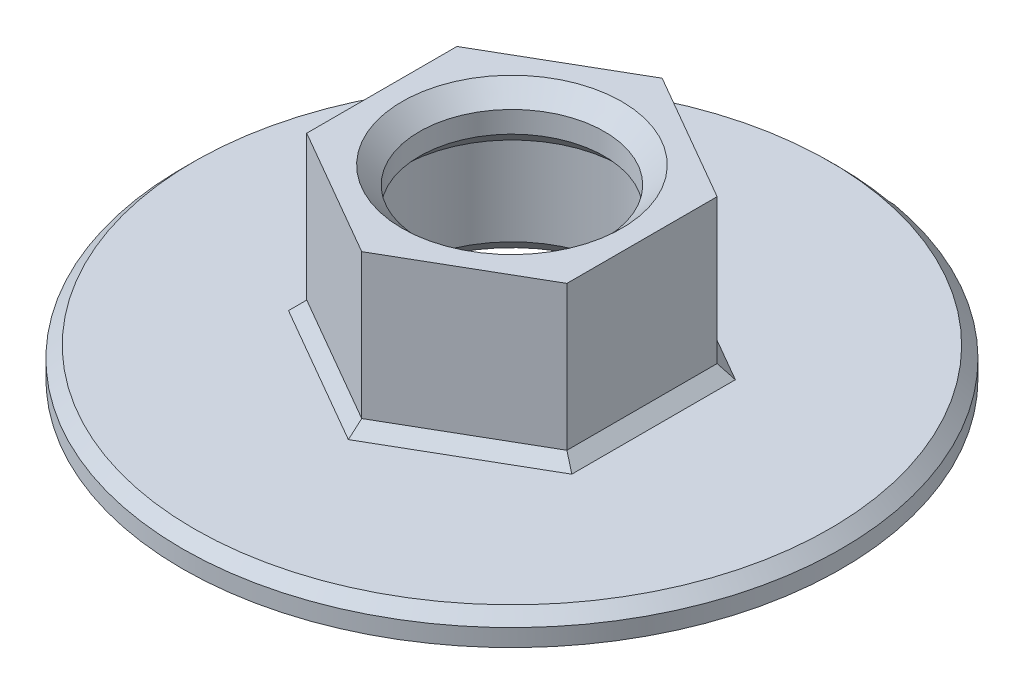
ISO-10303-21;
HEADER;
FILE_DESCRIPTION(('STEP AP214'),'2;1');
FILE_NAME('part.step','',(''),(''),'','','');
FILE_SCHEMA(('AUTOMOTIVE_DESIGN { 1 0 10303 214 1 1 1 1 }'));
ENDSEC;
DATA;
#1=APPLICATION_CONTEXT('core data for automotive mechanical design processes');
#2=APPLICATION_PROTOCOL_DEFINITION('international standard','automotive_design',2000,#1);
#3=PRODUCT_CONTEXT('',#1,'mechanical');
#4=PRODUCT('Part','Part','',(#3));
#5=PRODUCT_RELATED_PRODUCT_CATEGORY('part','',(#4));
#6=PRODUCT_DEFINITION_FORMATION('','',#4);
#7=PRODUCT_DEFINITION_CONTEXT('part definition',#1,'design');
#8=PRODUCT_DEFINITION('design','',#6,#7);
#9=PRODUCT_DEFINITION_SHAPE('','',#8);
#10=(LENGTH_UNIT() NAMED_UNIT(*) SI_UNIT(.MILLI.,.METRE.));
#11=(NAMED_UNIT(*) PLANE_ANGLE_UNIT() SI_UNIT($,.RADIAN.));
#12=(NAMED_UNIT(*) SI_UNIT($,.STERADIAN.) SOLID_ANGLE_UNIT());
#13=UNCERTAINTY_MEASURE_WITH_UNIT(LENGTH_MEASURE(1.E-05),#10,'distance_accuracy_value','');
#14=(GEOMETRIC_REPRESENTATION_CONTEXT(3) GLOBAL_UNCERTAINTY_ASSIGNED_CONTEXT((#13)) GLOBAL_UNIT_ASSIGNED_CONTEXT((#10,
#11,#12)) REPRESENTATION_CONTEXT('',''));
#15=CARTESIAN_POINT('',(0.,0.,0.));
#16=DIRECTION('',(0.,0.,1.));
#17=DIRECTION('',(1.,0.,0.));
#18=AXIS2_PLACEMENT_3D('',#15,#16,#17);
#19=CARTESIAN_POINT('',(0.,0.,0.));
#20=DIRECTION('',(0.,1.,0.));
#21=DIRECTION('',(0.,0.,1.));
#22=AXIS2_PLACEMENT_3D('',#19,#20,#21);
#23=PLANE('',#22);
#24=CARTESIAN_POINT('',(0.,0.,0.));
#25=DIRECTION('',(0.,1.,0.));
#26=DIRECTION('',(0.,0.,1.));
#27=AXIS2_PLACEMENT_3D('',#24,#25,#26);
#28=CIRCLE('',#27,11.175);
#29=CARTESIAN_POINT('',(0.,0.,11.175));
#30=VERTEX_POINT('',#29);
#31=EDGE_CURVE('E175',#30,#30,#28,.T.);
#32=ORIENTED_EDGE('',*,*,#31,.T.);
#33=EDGE_LOOP('',(#32));
#34=FACE_BOUND('',#33,.T.);
#35=CARTESIAN_POINT('',(0.,0.,0.));
#36=DIRECTION('',(0.,1.,0.));
#37=DIRECTION('',(0.,0.,1.));
#38=AXIS2_PLACEMENT_3D('',#35,#36,#37);
#39=CIRCLE('',#38,25.);
#40=CARTESIAN_POINT('',(-3.33679125812165,0.,-24.7763157894737));
#41=VERTEX_POINT('',#40);
#42=CARTESIAN_POINT('',(3.33679125812165,0.,-24.7763157894737));
#43=VERTEX_POINT('',#42);
#44=EDGE_CURVE('E162',#41,#43,#39,.T.);
#45=ORIENTED_EDGE('',*,*,#44,.F.);
#46=CARTESIAN_POINT('',(0.,0.,-28.5));
#47=DIRECTION('',(0.,1.,0.));
#48=DIRECTION('',(0.,0.,1.));
#49=AXIS2_PLACEMENT_3D('',#46,#47,#48);
#50=CIRCLE('',#49,5.00000000000001);
#51=CARTESIAN_POINT('',(-4.92965069306931,0.,-27.6642105263158));
#52=VERTEX_POINT('',#51);
#53=EDGE_CURVE('E62',#52,#41,#50,.T.);
#54=ORIENTED_EDGE('',*,*,#53,.F.);
#55=CARTESIAN_POINT('',(0.,0.,0.));
#56=DIRECTION('',(0.,1.,0.));
#57=DIRECTION('',(0.,0.,1.));
#58=AXIS2_PLACEMENT_3D('',#55,#56,#57);
#59=CIRCLE('',#58,28.1);
#60=CARTESIAN_POINT('',(4.92965069306931,0.,-27.6642105263158));
#61=VERTEX_POINT('',#60);
#62=EDGE_CURVE('E164',#52,#61,#59,.F.);
#63=ORIENTED_EDGE('',*,*,#62,.T.);
#64=EDGE_CURVE('E152',#43,#61,#50,.T.);
#65=ORIENTED_EDGE('',*,*,#64,.F.);
#66=EDGE_LOOP('',(#45,#54,#63,#65));
#67=FACE_BOUND('',#66,.T.);
#68=ADVANCED_FACE('F40',(#34,#67),#23,.F.);
#69=CARTESIAN_POINT('',(0.,0.6,0.));
#70=DIRECTION('',(0.,-1.,0.));
#71=DIRECTION('',(0.,0.,-1.));
#72=AXIS2_PLACEMENT_3D('',#69,#70,#71);
#73=CYLINDRICAL_SURFACE('',#72,9.675);
#74=CARTESIAN_POINT('',(0.,1.5,0.));
#75=DIRECTION('',(0.,1.,0.));
#76=DIRECTION('',(0.,0.,1.));
#77=AXIS2_PLACEMENT_3D('',#74,#75,#76);
#78=CIRCLE('',#77,9.675);
#79=CARTESIAN_POINT('',(0.,1.5,9.675));
#80=VERTEX_POINT('',#79);
#81=EDGE_CURVE('E169',#80,#80,#78,.F.);
#82=ORIENTED_EDGE('',*,*,#81,.T.);
#83=EDGE_LOOP('',(#82));
#84=FACE_BOUND('',#83,.T.);
#85=CARTESIAN_POINT('',(0.,9.25,0.));
#86=DIRECTION('',(0.,1.,0.));
#87=DIRECTION('',(0.,0.,1.));
#88=AXIS2_PLACEMENT_3D('',#85,#86,#87);
#89=CIRCLE('',#88,9.675);
#90=CARTESIAN_POINT('',(0.,9.25,9.675));
#91=VERTEX_POINT('',#90);
#92=EDGE_CURVE('E333',#91,#91,#89,.T.);
#93=ORIENTED_EDGE('',*,*,#92,.T.);
#94=EDGE_LOOP('',(#93));
#95=FACE_BOUND('',#94,.T.);
#96=ADVANCED_FACE('F286',(#84,#95),#73,.F.);
#97=CARTESIAN_POINT('',(0.,0.6,0.));
#98=DIRECTION('',(0.,1.,0.));
#99=DIRECTION('',(0.,0.,1.));
#100=AXIS2_PLACEMENT_3D('',#97,#98,#99);
#101=PLANE('',#100);
#102=DIRECTION('',(0.,0.,1.));
#103=VECTOR('',#102,1.);
#104=CARTESIAN_POINT('',(12.25,0.6,0.));
#105=LINE('',#104,#103);
#106=CARTESIAN_POINT('',(12.25,0.6,-7.07254079757292));
#107=VERTEX_POINT('',#106);
#108=CARTESIAN_POINT('',(12.25,0.6,7.07254079757292));
#109=VERTEX_POINT('',#108);
#110=EDGE_CURVE('E192',#107,#109,#105,.T.);
#111=ORIENTED_EDGE('',*,*,#110,.T.);
#112=DIRECTION('',(-0.866025403784439,0.,0.5));
#113=VECTOR('',#112,1.);
#114=CARTESIAN_POINT('',(6.125,0.6,10.6088111963594));
#115=LINE('',#114,#113);
#116=CARTESIAN_POINT('',(0.,0.6,14.1450815951458));
#117=VERTEX_POINT('',#116);
#118=EDGE_CURVE('E194',#109,#117,#115,.T.);
#119=ORIENTED_EDGE('',*,*,#118,.T.);
#120=DIRECTION('',(-0.866025403784439,0.,-0.5));
#121=VECTOR('',#120,1.);
#122=CARTESIAN_POINT('',(-6.125,0.6,10.6088111963594));
#123=LINE('',#122,#121);
#124=CARTESIAN_POINT('',(-12.25,0.6,7.07254079757292));
#125=VERTEX_POINT('',#124);
#126=EDGE_CURVE('E184',#117,#125,#123,.T.);
#127=ORIENTED_EDGE('',*,*,#126,.T.);
#128=DIRECTION('',(0.,0.,-1.));
#129=VECTOR('',#128,1.);
#130=CARTESIAN_POINT('',(-12.25,0.6,0.));
#131=LINE('',#130,#129);
#132=CARTESIAN_POINT('',(-12.25,0.6,-7.07254079757292));
#133=VERTEX_POINT('',#132);
#134=EDGE_CURVE('E186',#125,#133,#131,.T.);
#135=ORIENTED_EDGE('',*,*,#134,.T.);
#136=DIRECTION('',(0.866025403784439,0.,-0.5));
#137=VECTOR('',#136,1.);
#138=CARTESIAN_POINT('',(-6.125,0.6,-10.6088111963594));
#139=LINE('',#138,#137);
#140=CARTESIAN_POINT('',(0.,0.6,-14.1450815951458));
#141=VERTEX_POINT('',#140);
#142=EDGE_CURVE('E188',#133,#141,#139,.T.);
#143=ORIENTED_EDGE('',*,*,#142,.T.);
#144=DIRECTION('',(0.866025403784439,0.,0.5));
#145=VECTOR('',#144,1.);
#146=CARTESIAN_POINT('',(6.125,0.6,-10.6088111963594));
#147=LINE('',#146,#145);
#148=EDGE_CURVE('E190',#141,#107,#147,.T.);
#149=ORIENTED_EDGE('',*,*,#148,.T.);
#150=EDGE_LOOP('',(#111,#119,#127,#135,#143,#149));
#151=FACE_BOUND('',#150,.T.);
#152=CARTESIAN_POINT('',(0.,0.6,0.));
#153=DIRECTION('',(0.,1.,0.));
#154=DIRECTION('',(0.,0.,1.));
#155=AXIS2_PLACEMENT_3D('',#152,#153,#154);
#156=CIRCLE('',#155,27.5);
#157=CARTESIAN_POINT('',(0.,0.6,27.5));
#158=VERTEX_POINT('',#157);
#159=EDGE_CURVE('E172',#158,#158,#156,.T.);
#160=ORIENTED_EDGE('',*,*,#159,.T.);
#161=EDGE_LOOP('',(#160));
#162=FACE_BOUND('',#161,.T.);
#163=ADVANCED_FACE('F263',(#151,#162),#101,.T.);
#164=CARTESIAN_POINT('',(0.,14.1,0.));
#165=DIRECTION('',(0.,1.,0.));
#166=DIRECTION('',(0.,0.,1.));
#167=AXIS2_PLACEMENT_3D('',#164,#165,#166);
#168=PLANE('',#167);
#169=CARTESIAN_POINT('',(0.,14.1,0.));
#170=DIRECTION('',(0.,1.,0.));
#171=DIRECTION('',(0.,0.,1.));
#172=AXIS2_PLACEMENT_3D('',#169,#170,#171);
#173=CIRCLE('',#172,9.50000000000001);
#174=CARTESIAN_POINT('',(0.,14.1,9.50000000000001));
#175=VERTEX_POINT('',#174);
#176=EDGE_CURVE('E321',#175,#175,#173,.F.);
#177=ORIENTED_EDGE('',*,*,#176,.T.);
#178=EDGE_LOOP('',(#177));
#179=FACE_BOUND('',#178,.T.);
#180=DIRECTION('',(-0.866025403784439,0.,-0.5));
#181=VECTOR('',#180,1.);
#182=CARTESIAN_POINT('',(11.25,14.1,-6.4951905283833));
#183=LINE('',#182,#181);
#184=CARTESIAN_POINT('',(11.25,14.1,-6.4951905283833));
#185=VERTEX_POINT('',#184);
#186=CARTESIAN_POINT('',(0.,14.1,-12.9903810567666));
#187=VERTEX_POINT('',#186);
#188=EDGE_CURVE('E336',#185,#187,#183,.T.);
#189=ORIENTED_EDGE('',*,*,#188,.T.);
#190=DIRECTION('',(-0.866025403784439,0.,0.5));
#191=VECTOR('',#190,1.);
#192=CARTESIAN_POINT('',(0.,14.1,-12.9903810567666));
#193=LINE('',#192,#191);
#194=CARTESIAN_POINT('',(-11.25,14.1,-6.49519052838329));
#195=VERTEX_POINT('',#194);
#196=EDGE_CURVE('E361',#187,#195,#193,.T.);
#197=ORIENTED_EDGE('',*,*,#196,.T.);
#198=DIRECTION('',(0.,0.,1.));
#199=VECTOR('',#198,1.);
#200=CARTESIAN_POINT('',(-11.25,14.1,-6.49519052838329));
#201=LINE('',#200,#199);
#202=CARTESIAN_POINT('',(-11.25,14.1,6.49519052838329));
#203=VERTEX_POINT('',#202);
#204=EDGE_CURVE('E359',#195,#203,#201,.T.);
#205=ORIENTED_EDGE('',*,*,#204,.T.);
#206=DIRECTION('',(0.866025403784439,0.,0.5));
#207=VECTOR('',#206,1.);
#208=CARTESIAN_POINT('',(-11.25,14.1,6.49519052838329));
#209=LINE('',#208,#207);
#210=CARTESIAN_POINT('',(0.,14.1,12.9903810567666));
#211=VERTEX_POINT('',#210);
#212=EDGE_CURVE('E357',#203,#211,#209,.T.);
#213=ORIENTED_EDGE('',*,*,#212,.T.);
#214=DIRECTION('',(0.866025403784439,0.,-0.5));
#215=VECTOR('',#214,1.);
#216=CARTESIAN_POINT('',(0.,14.1,12.9903810567666));
#217=LINE('',#216,#215);
#218=CARTESIAN_POINT('',(11.25,14.1,6.49519052838329));
#219=VERTEX_POINT('',#218);
#220=EDGE_CURVE('E355',#211,#219,#217,.T.);
#221=ORIENTED_EDGE('',*,*,#220,.T.);
#222=DIRECTION('',(0.,0.,-1.));
#223=VECTOR('',#222,1.);
#224=CARTESIAN_POINT('',(11.25,14.1,6.49519052838329));
#225=LINE('',#224,#223);
#226=EDGE_CURVE('E353',#219,#185,#225,.T.);
#227=ORIENTED_EDGE('',*,*,#226,.T.);
#228=EDGE_LOOP('',(#189,#197,#205,#213,#221,#227));
#229=FACE_BOUND('',#228,.T.);
#230=ADVANCED_FACE('F259',(#179,#229),#168,.T.);
#231=CARTESIAN_POINT('',(11.25,14.1,-6.4951905283833));
#232=DIRECTION('',(-0.5,0.,0.866025403784439));
#233=DIRECTION('',(0.866025403784439,0.,0.5));
#234=AXIS2_PLACEMENT_3D('',#231,#232,#233);
#235=PLANE('',#234);
#236=DIRECTION('',(0.,-1.,0.));
#237=VECTOR('',#236,1.);
#238=CARTESIAN_POINT('',(11.25,14.1,-6.4951905283833));
#239=LINE('',#238,#237);
#240=CARTESIAN_POINT('',(11.25,1.60000000000001,-6.4951905283833));
#241=VERTEX_POINT('',#240);
#242=EDGE_CURVE('E350',#185,#241,#239,.T.);
#243=ORIENTED_EDGE('',*,*,#242,.T.);
#244=DIRECTION('',(-0.866025403784439,0.,-0.5));
#245=VECTOR('',#244,1.);
#246=CARTESIAN_POINT('',(11.25,1.60000000000001,-6.4951905283833));
#247=LINE('',#246,#245);
#248=CARTESIAN_POINT('',(0.,1.60000000000001,-12.9903810567666));
#249=VERTEX_POINT('',#248);
#250=EDGE_CURVE('E199',#241,#249,#247,.T.);
#251=ORIENTED_EDGE('',*,*,#250,.T.);
#252=DIRECTION('',(0.,-1.,0.));
#253=VECTOR('',#252,1.);
#254=CARTESIAN_POINT('',(0.,14.1,-12.9903810567666));
#255=LINE('',#254,#253);
#256=EDGE_CURVE('E332',#187,#249,#255,.T.);
#257=ORIENTED_EDGE('',*,*,#256,.F.);
#258=ORIENTED_EDGE('',*,*,#188,.F.);
#259=EDGE_LOOP('',(#243,#251,#257,#258));
#260=FACE_BOUND('',#259,.T.);
#261=ADVANCED_FACE('F262',(#260),#235,.F.);
#262=CARTESIAN_POINT('',(0.,14.1,-12.9903810567666));
#263=DIRECTION('',(0.5,0.,0.866025403784439));
#264=DIRECTION('',(0.866025403784439,0.,-0.5));
#265=AXIS2_PLACEMENT_3D('',#262,#263,#264);
#266=PLANE('',#265);
#267=ORIENTED_EDGE('',*,*,#256,.T.);
#268=DIRECTION('',(-0.866025403784439,0.,0.5));
#269=VECTOR('',#268,1.);
#270=CARTESIAN_POINT('',(0.,1.60000000000001,-12.9903810567666));
#271=LINE('',#270,#269);
#272=CARTESIAN_POINT('',(-11.25,1.60000000000001,-6.49519052838329));
#273=VERTEX_POINT('',#272);
#274=EDGE_CURVE('E201',#249,#273,#271,.T.);
#275=ORIENTED_EDGE('',*,*,#274,.T.);
#276=DIRECTION('',(0.,-1.,0.));
#277=VECTOR('',#276,1.);
#278=CARTESIAN_POINT('',(-11.25,14.1,-6.49519052838329));
#279=LINE('',#278,#277);
#280=EDGE_CURVE('E340',#195,#273,#279,.T.);
#281=ORIENTED_EDGE('',*,*,#280,.F.);
#282=ORIENTED_EDGE('',*,*,#196,.F.);
#283=EDGE_LOOP('',(#267,#275,#281,#282));
#284=FACE_BOUND('',#283,.T.);
#285=ADVANCED_FACE('F279',(#284),#266,.F.);
#286=CARTESIAN_POINT('',(-11.25,14.1,-6.49519052838329));
#287=DIRECTION('',(1.,0.,0.));
#288=DIRECTION('',(0.,0.,-1.));
#289=AXIS2_PLACEMENT_3D('',#286,#287,#288);
#290=PLANE('',#289);
#291=ORIENTED_EDGE('',*,*,#280,.T.);
#292=DIRECTION('',(0.,0.,1.));
#293=VECTOR('',#292,1.);
#294=CARTESIAN_POINT('',(-11.25,1.60000000000001,-6.49519052838329));
#295=LINE('',#294,#293);
#296=CARTESIAN_POINT('',(-11.25,1.60000000000001,6.49519052838329));
#297=VERTEX_POINT('',#296);
#298=EDGE_CURVE('E70',#273,#297,#295,.T.);
#299=ORIENTED_EDGE('',*,*,#298,.T.);
#300=DIRECTION('',(0.,-1.,0.));
#301=VECTOR('',#300,1.);
#302=CARTESIAN_POINT('',(-11.25,14.1,6.49519052838329));
#303=LINE('',#302,#301);
#304=EDGE_CURVE('E342',#203,#297,#303,.T.);
#305=ORIENTED_EDGE('',*,*,#304,.F.);
#306=ORIENTED_EDGE('',*,*,#204,.F.);
#307=EDGE_LOOP('',(#291,#299,#305,#306));
#308=FACE_BOUND('',#307,.T.);
#309=ADVANCED_FACE('F275',(#308),#290,.F.);
#310=CARTESIAN_POINT('',(-11.25,14.1,6.49519052838329));
#311=DIRECTION('',(0.5,0.,-0.866025403784439));
#312=DIRECTION('',(-0.866025403784439,0.,-0.5));
#313=AXIS2_PLACEMENT_3D('',#310,#311,#312);
#314=PLANE('',#313);
#315=ORIENTED_EDGE('',*,*,#304,.T.);
#316=DIRECTION('',(0.866025403784439,0.,0.5));
#317=VECTOR('',#316,1.);
#318=CARTESIAN_POINT('',(-11.25,1.60000000000001,6.49519052838329));
#319=LINE('',#318,#317);
#320=CARTESIAN_POINT('',(0.,1.60000000000001,12.9903810567666));
#321=VERTEX_POINT('',#320);
#322=EDGE_CURVE('E204',#297,#321,#319,.T.);
#323=ORIENTED_EDGE('',*,*,#322,.T.);
#324=DIRECTION('',(0.,-1.,0.));
#325=VECTOR('',#324,1.);
#326=CARTESIAN_POINT('',(0.,14.1,12.9903810567666));
#327=LINE('',#326,#325);
#328=EDGE_CURVE('E344',#211,#321,#327,.T.);
#329=ORIENTED_EDGE('',*,*,#328,.F.);
#330=ORIENTED_EDGE('',*,*,#212,.F.);
#331=EDGE_LOOP('',(#315,#323,#329,#330));
#332=FACE_BOUND('',#331,.T.);
#333=ADVANCED_FACE('F271',(#332),#314,.F.);
#334=CARTESIAN_POINT('',(0.,14.1,12.9903810567666));
#335=DIRECTION('',(-0.5,0.,-0.866025403784439));
#336=DIRECTION('',(-0.866025403784439,0.,0.5));
#337=AXIS2_PLACEMENT_3D('',#334,#335,#336);
#338=PLANE('',#337);
#339=ORIENTED_EDGE('',*,*,#328,.T.);
#340=DIRECTION('',(0.866025403784439,0.,-0.5));
#341=VECTOR('',#340,1.);
#342=CARTESIAN_POINT('',(0.,1.60000000000001,12.9903810567666));
#343=LINE('',#342,#341);
#344=CARTESIAN_POINT('',(11.25,1.60000000000001,6.49519052838329));
#345=VERTEX_POINT('',#344);
#346=EDGE_CURVE('E181',#321,#345,#343,.T.);
#347=ORIENTED_EDGE('',*,*,#346,.T.);
#348=DIRECTION('',(0.,-1.,0.));
#349=VECTOR('',#348,1.);
#350=CARTESIAN_POINT('',(11.25,14.1,6.49519052838329));
#351=LINE('',#350,#349);
#352=EDGE_CURVE('E347',#219,#345,#351,.T.);
#353=ORIENTED_EDGE('',*,*,#352,.F.);
#354=ORIENTED_EDGE('',*,*,#220,.F.);
#355=EDGE_LOOP('',(#339,#347,#353,#354));
#356=FACE_BOUND('',#355,.T.);
#357=ADVANCED_FACE('F267',(#356),#338,.F.);
#358=CARTESIAN_POINT('',(11.25,14.1,6.49519052838329));
#359=DIRECTION('',(-1.,0.,0.));
#360=DIRECTION('',(0.,0.,1.));
#361=AXIS2_PLACEMENT_3D('',#358,#359,#360);
#362=PLANE('',#361);
#363=ORIENTED_EDGE('',*,*,#352,.T.);
#364=DIRECTION('',(0.,0.,-1.));
#365=VECTOR('',#364,1.);
#366=CARTESIAN_POINT('',(11.25,1.60000000000001,6.49519052838329));
#367=LINE('',#366,#365);
#368=EDGE_CURVE('E197',#345,#241,#367,.T.);
#369=ORIENTED_EDGE('',*,*,#368,.T.);
#370=ORIENTED_EDGE('',*,*,#242,.F.);
#371=ORIENTED_EDGE('',*,*,#226,.F.);
#372=EDGE_LOOP('',(#363,#369,#370,#371));
#373=FACE_BOUND('',#372,.T.);
#374=ADVANCED_FACE('F253',(#373),#362,.F.);
#375=CARTESIAN_POINT('',(0.,9.25,0.));
#376=DIRECTION('',(0.,1.,0.));
#377=DIRECTION('',(0.,0.,1.));
#378=AXIS2_PLACEMENT_3D('',#375,#376,#377);
#379=PLANE('',#378);
#380=CARTESIAN_POINT('',(0.,9.25,0.));
#381=DIRECTION('',(0.,1.,0.));
#382=DIRECTION('',(0.,0.,1.));
#383=AXIS2_PLACEMENT_3D('',#380,#381,#382);
#384=CIRCLE('',#383,9.50000000000003);
#385=CARTESIAN_POINT('',(0.,9.25,9.50000000000003));
#386=VERTEX_POINT('',#385);
#387=EDGE_CURVE('E319',#386,#386,#384,.T.);
#388=ORIENTED_EDGE('',*,*,#387,.T.);
#389=EDGE_LOOP('',(#388));
#390=FACE_BOUND('',#389,.T.);
#391=ORIENTED_EDGE('',*,*,#92,.F.);
#392=EDGE_LOOP('',(#391));
#393=FACE_BOUND('',#392,.T.);
#394=ADVANCED_FACE('F249',(#390,#393),#379,.F.);
#395=CARTESIAN_POINT('',(0.,-28.4073740507555,0.));
#396=DIRECTION('',(0.,1.,0.));
#397=DIRECTION('',(0.,0.,1.));
#398=AXIS2_PLACEMENT_3D('',#395,#396,#397);
#399=CYLINDRICAL_SURFACE('',#398,8.);
#400=CARTESIAN_POINT('',(0.,12.6,0.));
#401=DIRECTION('',(0.,1.,0.));
#402=DIRECTION('',(0.,0.,1.));
#403=AXIS2_PLACEMENT_3D('',#400,#401,#402);
#404=CIRCLE('',#403,8.);
#405=CARTESIAN_POINT('',(0.,12.6,8.));
#406=VERTEX_POINT('',#405);
#407=EDGE_CURVE('E326',#406,#406,#404,.T.);
#408=ORIENTED_EDGE('',*,*,#407,.T.);
#409=EDGE_LOOP('',(#408));
#410=FACE_BOUND('',#409,.T.);
#411=CARTESIAN_POINT('',(0.,10.75,0.));
#412=DIRECTION('',(0.,1.,0.));
#413=DIRECTION('',(0.,0.,1.));
#414=AXIS2_PLACEMENT_3D('',#411,#412,#413);
#415=CIRCLE('',#414,8.);
#416=CARTESIAN_POINT('',(0.,10.75,8.));
#417=VERTEX_POINT('',#416);
#418=EDGE_CURVE('E329',#417,#417,#415,.F.);
#419=ORIENTED_EDGE('',*,*,#418,.T.);
#420=EDGE_LOOP('',(#419));
#421=FACE_BOUND('',#420,.T.);
#422=ADVANCED_FACE('F252',(#410,#421),#399,.F.);
#423=CARTESIAN_POINT('',(0.,12.6,0.));
#424=DIRECTION('',(0.,1.,0.));
#425=DIRECTION('',(0.,0.,1.));
#426=AXIS2_PLACEMENT_3D('',#423,#424,#425);
#427=CONICAL_SURFACE('',#426,8.,0.785398163397448);
#428=ORIENTED_EDGE('',*,*,#176,.F.);
#429=EDGE_LOOP('',(#428));
#430=FACE_BOUND('',#429,.T.);
#431=ORIENTED_EDGE('',*,*,#407,.F.);
#432=EDGE_LOOP('',(#431));
#433=FACE_BOUND('',#432,.T.);
#434=ADVANCED_FACE('F257',(#430,#433),#427,.F.);
#435=CARTESIAN_POINT('',(0.,10.75,0.));
#436=DIRECTION('',(0.,-1.,0.));
#437=DIRECTION('',(0.,0.,-1.));
#438=AXIS2_PLACEMENT_3D('',#435,#436,#437);
#439=CONICAL_SURFACE('',#438,8.,0.785398163397454);
#440=ORIENTED_EDGE('',*,*,#387,.F.);
#441=EDGE_LOOP('',(#440));
#442=FACE_BOUND('',#441,.T.);
#443=ORIENTED_EDGE('',*,*,#418,.F.);
#444=EDGE_LOOP('',(#443));
#445=FACE_BOUND('',#444,.T.);
#446=ADVANCED_FACE('F302',(#442,#445),#439,.F.);
#447=CARTESIAN_POINT('',(0.,0.,0.));
#448=DIRECTION('',(0.,-1.,0.));
#449=DIRECTION('',(0.,0.,-1.));
#450=AXIS2_PLACEMENT_3D('',#447,#448,#449);
#451=CONICAL_SURFACE('',#450,11.175,0.785398163397448);
#452=ORIENTED_EDGE('',*,*,#81,.F.);
#453=EDGE_LOOP('',(#452));
#454=FACE_BOUND('',#453,.T.);
#455=ORIENTED_EDGE('',*,*,#31,.F.);
#456=EDGE_LOOP('',(#455));
#457=FACE_BOUND('',#456,.T.);
#458=ADVANCED_FACE('F248',(#454,#457),#451,.F.);
#459=CARTESIAN_POINT('',(0.,81.2101730552664,0.));
#460=DIRECTION('',(0.,-1.,0.));
#461=DIRECTION('',(0.,0.,-1.));
#462=AXIS2_PLACEMENT_3D('',#459,#460,#461);
#463=CYLINDRICAL_SURFACE('',#462,25.);
#464=ORIENTED_EDGE('',*,*,#44,.T.);
#465=DIRECTION('',(0.,1.,0.));
#466=VECTOR('',#465,1.);
#467=CARTESIAN_POINT('',(3.33679125812165,-8.4,-24.7763157894737));
#468=LINE('',#467,#466);
#469=CARTESIAN_POINT('',(3.33679125812165,-1.9,-24.7763157894737));
#470=VERTEX_POINT('',#469);
#471=EDGE_CURVE('E149',#470,#43,#468,.T.);
#472=ORIENTED_EDGE('',*,*,#471,.F.);
#473=CARTESIAN_POINT('',(0.,-1.9,0.));
#474=DIRECTION('',(0.,-1.,0.));
#475=DIRECTION('',(0.,0.,-1.));
#476=AXIS2_PLACEMENT_3D('',#473,#474,#475);
#477=CIRCLE('',#476,25.);
#478=CARTESIAN_POINT('',(-3.33679125812165,-1.9,-24.7763157894737));
#479=VERTEX_POINT('',#478);
#480=EDGE_CURVE('E222',#470,#479,#477,.T.);
#481=ORIENTED_EDGE('',*,*,#480,.T.);
#482=DIRECTION('',(0.,1.,0.));
#483=VECTOR('',#482,1.);
#484=CARTESIAN_POINT('',(-3.33679125812165,-8.4,-24.7763157894737));
#485=LINE('',#484,#483);
#486=EDGE_CURVE('E160',#479,#41,#485,.T.);
#487=ORIENTED_EDGE('',*,*,#486,.T.);
#488=EDGE_LOOP('',(#464,#472,#481,#487));
#489=FACE_BOUND('',#488,.T.);
#490=ADVANCED_FACE('F167',(#489),#463,.F.);
#491=CARTESIAN_POINT('',(0.,81.2101730552664,0.));
#492=DIRECTION('',(0.,-1.,0.));
#493=DIRECTION('',(0.,0.,-1.));
#494=AXIS2_PLACEMENT_3D('',#491,#492,#493);
#495=CYLINDRICAL_SURFACE('',#494,28.5);
#496=DIRECTION('',(0.,1.,0.));
#497=VECTOR('',#496,1.);
#498=CARTESIAN_POINT('',(4.98072616371172,-4.2,-28.0614035087719));
#499=LINE('',#498,#497);
#500=CARTESIAN_POINT('',(4.98072616371172,-0.400000000000011,-28.0614035087719));
#501=VERTEX_POINT('',#500);
#502=CARTESIAN_POINT('',(4.98072616371172,-1.9,-28.0614035087719));
#503=VERTEX_POINT('',#502);
#504=EDGE_CURVE('E368',#501,#503,#499,.F.);
#505=ORIENTED_EDGE('',*,*,#504,.F.);
#506=CARTESIAN_POINT('',(0.,-0.400000000000011,0.));
#507=DIRECTION('',(0.,1.,0.));
#508=DIRECTION('',(0.,0.,1.));
#509=AXIS2_PLACEMENT_3D('',#506,#507,#508);
#510=CIRCLE('',#509,28.5);
#511=CARTESIAN_POINT('',(-4.98072616371172,-0.400000000000011,-28.0614035087719));
#512=VERTEX_POINT('',#511);
#513=EDGE_CURVE('E168',#501,#512,#510,.F.);
#514=ORIENTED_EDGE('',*,*,#513,.T.);
#515=DIRECTION('',(0.,1.,0.));
#516=VECTOR('',#515,1.);
#517=CARTESIAN_POINT('',(-4.98072616371172,-4.2,-28.0614035087719));
#518=LINE('',#517,#516);
#519=CARTESIAN_POINT('',(-4.98072616371173,-1.9,-28.0614035087719));
#520=VERTEX_POINT('',#519);
#521=EDGE_CURVE('E372',#520,#512,#518,.T.);
#522=ORIENTED_EDGE('',*,*,#521,.F.);
#523=CARTESIAN_POINT('',(0.,-1.9,0.));
#524=DIRECTION('',(0.,-1.,0.));
#525=DIRECTION('',(0.,0.,-1.));
#526=AXIS2_PLACEMENT_3D('',#523,#524,#525);
#527=CIRCLE('',#526,28.5);
#528=EDGE_CURVE('E337',#503,#520,#527,.T.);
#529=ORIENTED_EDGE('',*,*,#528,.F.);
#530=EDGE_LOOP('',(#505,#514,#522,#529));
#531=FACE_BOUND('',#530,.T.);
#532=ADVANCED_FACE('F241',(#531),#495,.T.);
#533=CARTESIAN_POINT('',(0.,-1.9,0.));
#534=DIRECTION('',(0.,-1.,0.));
#535=DIRECTION('',(0.,0.,-1.));
#536=AXIS2_PLACEMENT_3D('',#533,#534,#535);
#537=PLANE('',#536);
#538=CARTESIAN_POINT('',(0.,-1.9,-28.5));
#539=DIRECTION('',(0.,-1.,0.));
#540=DIRECTION('',(0.,0.,-1.));
#541=AXIS2_PLACEMENT_3D('',#538,#539,#540);
#542=CIRCLE('',#541,5.00000000000001);
#543=EDGE_CURVE('E155',#503,#470,#542,.T.);
#544=ORIENTED_EDGE('',*,*,#543,.F.);
#545=ORIENTED_EDGE('',*,*,#528,.T.);
#546=EDGE_CURVE('E370',#479,#520,#542,.T.);
#547=ORIENTED_EDGE('',*,*,#546,.F.);
#548=ORIENTED_EDGE('',*,*,#480,.F.);
#549=EDGE_LOOP('',(#544,#545,#547,#548));
#550=FACE_BOUND('',#549,.T.);
#551=ADVANCED_FACE('F237',(#550),#537,.T.);
#552=CARTESIAN_POINT('',(0.,-0.400000000000011,0.));
#553=DIRECTION('',(0.,-1.,0.));
#554=DIRECTION('',(0.,0.,-1.));
#555=AXIS2_PLACEMENT_3D('',#552,#553,#554);
#556=CONICAL_SURFACE('',#555,28.5,0.785398163397443);
#557=CARTESIAN_POINT('',(4.92961725637284,0.000200000000001495,-27.6640133340351));
#558=CARTESIAN_POINT('',(4.94078757578313,-0.0665973841032549,-27.729873192276));
#559=CARTESIAN_POINT('',(4.95063327841352,-0.13336274282116,-27.7959356360159));
#560=CARTESIAN_POINT('',(4.96767545011471,-0.266829409487834,-27.9284656944954));
#561=CARTESIAN_POINT('',(4.97487191918545,-0.333530717436602,-27.994933309235));
#562=CARTESIAN_POINT('',(4.98074377147623,-0.400200000000016,-28.0616035094736));
#563=B_SPLINE_CURVE_WITH_KNOTS('',3,(#557,#558,#559,#560,#561,#562),.UNSPECIFIED.,.F.,.F.,(4,2,
4),(0.,0.283318155297526,0.566636310601701),.UNSPECIFIED.);
#564=EDGE_CURVE('E12',#61,#501,#563,.T.);
#565=ORIENTED_EDGE('',*,*,#564,.F.);
#566=ORIENTED_EDGE('',*,*,#62,.F.);
#567=CARTESIAN_POINT('',(-4.98074377147573,-0.400200000000013,-28.0616035094737));
#568=CARTESIAN_POINT('',(-4.97487191918511,-0.333530717436604,-27.9949333092351));
#569=CARTESIAN_POINT('',(-4.96767545011454,-0.266829409487842,-27.9284656944955));
#570=CARTESIAN_POINT('',(-4.95063327841369,-0.133362742821176,-27.7959356360159));
#571=CARTESIAN_POINT('',(-4.94078757578347,-0.0665973841032751,-27.729873192276));
#572=CARTESIAN_POINT('',(-4.92961725637337,0.000199999999978918,-27.664013334035));
#573=B_SPLINE_CURVE_WITH_KNOTS('',3,(#567,#568,#569,#570,#571,#572),.UNSPECIFIED.,.F.,.F.,(4,2,
4),(0.,0.28331815530418,0.566636310601699),.UNSPECIFIED.);
#574=EDGE_CURVE('E55',#512,#52,#573,.T.);
#575=ORIENTED_EDGE('',*,*,#574,.F.);
#576=ORIENTED_EDGE('',*,*,#513,.F.);
#577=EDGE_LOOP('',(#565,#566,#575,#576));
#578=FACE_BOUND('',#577,.T.);
#579=ORIENTED_EDGE('',*,*,#159,.F.);
#580=EDGE_LOOP('',(#579));
#581=FACE_BOUND('',#580,.T.);
#582=ADVANCED_FACE('F228',(#578,#581),#556,.T.);
#583=CARTESIAN_POINT('',(0.,1.60000000000001,-12.9903810567666));
#584=DIRECTION('',(0.353553390593275,-0.707106781186545,0.612372435695797));
#585=DIRECTION('',(-0.866025403784439,0.,0.5));
#586=AXIS2_PLACEMENT_3D('',#583,#584,#585);
#587=PLANE('',#586);
#588=DIRECTION('',(0.,-0.654653670707981,-0.755928946018451));
#589=VECTOR('',#588,1.);
#590=CARTESIAN_POINT('',(0.,1.60000000000001,-12.9903810567666));
#591=LINE('',#590,#589);
#592=EDGE_CURVE('E216',#141,#249,#591,.F.);
#593=ORIENTED_EDGE('',*,*,#592,.F.);
#594=ORIENTED_EDGE('',*,*,#142,.F.);
#595=DIRECTION('',(-0.654653670707974,-0.654653670707981,-0.377964473009227));
#596=VECTOR('',#595,1.);
#597=CARTESIAN_POINT('',(-11.25,1.60000000000001,-6.49519052838329));
#598=LINE('',#597,#596);
#599=EDGE_CURVE('E219',#273,#133,#598,.T.);
#600=ORIENTED_EDGE('',*,*,#599,.F.);
#601=ORIENTED_EDGE('',*,*,#274,.F.);
#602=EDGE_LOOP('',(#593,#594,#600,#601));
#603=FACE_BOUND('',#602,.T.);
#604=ADVANCED_FACE('F43',(#603),#587,.F.);
#605=CARTESIAN_POINT('',(-11.25,1.60000000000001,-6.49519052838329));
#606=DIRECTION('',(0.707106781186551,-0.707106781186544,0.));
#607=DIRECTION('',(0.,0.,1.));
#608=AXIS2_PLACEMENT_3D('',#605,#606,#607);
#609=PLANE('',#608);
#610=ORIENTED_EDGE('',*,*,#599,.T.);
#611=ORIENTED_EDGE('',*,*,#134,.F.);
#612=DIRECTION('',(-0.654653670707974,-0.654653670707981,0.377964473009226));
#613=VECTOR('',#612,1.);
#614=CARTESIAN_POINT('',(-11.25,1.60000000000001,6.49519052838329));
#615=LINE('',#614,#613);
#616=EDGE_CURVE('E213',#297,#125,#615,.T.);
#617=ORIENTED_EDGE('',*,*,#616,.F.);
#618=ORIENTED_EDGE('',*,*,#298,.F.);
#619=EDGE_LOOP('',(#610,#611,#617,#618));
#620=FACE_BOUND('',#619,.T.);
#621=ADVANCED_FACE('F388',(#620),#609,.F.);
#622=CARTESIAN_POINT('',(11.25,1.60000000000001,-6.4951905283833));
#623=DIRECTION('',(-0.353553390593276,-0.707106781186544,0.612372435695798));
#624=DIRECTION('',(-0.866025403784439,0.,-0.5));
#625=AXIS2_PLACEMENT_3D('',#622,#623,#624);
#626=PLANE('',#625);
#627=ORIENTED_EDGE('',*,*,#592,.T.);
#628=ORIENTED_EDGE('',*,*,#250,.F.);
#629=DIRECTION('',(0.654653670707976,-0.654653670707981,-0.377964473009224));
#630=VECTOR('',#629,1.);
#631=CARTESIAN_POINT('',(11.25,1.60000000000001,-6.4951905283833));
#632=LINE('',#631,#630);
#633=EDGE_CURVE('E210',#107,#241,#632,.F.);
#634=ORIENTED_EDGE('',*,*,#633,.F.);
#635=ORIENTED_EDGE('',*,*,#148,.F.);
#636=EDGE_LOOP('',(#627,#628,#634,#635));
#637=FACE_BOUND('',#636,.T.);
#638=ADVANCED_FACE('F393',(#637),#626,.F.);
#639=CARTESIAN_POINT('',(-11.25,1.60000000000001,6.49519052838329));
#640=DIRECTION('',(0.353553390593276,-0.707106781186544,-0.612372435695798));
#641=DIRECTION('',(0.866025403784439,0.,0.5));
#642=AXIS2_PLACEMENT_3D('',#639,#640,#641);
#643=PLANE('',#642);
#644=ORIENTED_EDGE('',*,*,#616,.T.);
#645=ORIENTED_EDGE('',*,*,#126,.F.);
#646=DIRECTION('',(0.,0.654653670707981,-0.755928946018451));
#647=VECTOR('',#646,1.);
#648=CARTESIAN_POINT('',(0.,4.81428571428574,9.27884361197615));
#649=LINE('',#648,#647);
#650=EDGE_CURVE('E208',#321,#117,#649,.F.);
#651=ORIENTED_EDGE('',*,*,#650,.F.);
#652=ORIENTED_EDGE('',*,*,#322,.F.);
#653=EDGE_LOOP('',(#644,#645,#651,#652));
#654=FACE_BOUND('',#653,.T.);
#655=ADVANCED_FACE('F410',(#654),#643,.F.);
#656=CARTESIAN_POINT('',(11.25,1.60000000000001,6.49519052838329));
#657=DIRECTION('',(-0.70710678118655,-0.707106781186545,0.));
#658=DIRECTION('',(0.,0.,-1.));
#659=AXIS2_PLACEMENT_3D('',#656,#657,#658);
#660=PLANE('',#659);
#661=ORIENTED_EDGE('',*,*,#633,.T.);
#662=ORIENTED_EDGE('',*,*,#368,.F.);
#663=DIRECTION('',(0.654653670707975,-0.65465367070798,0.377964473009225));
#664=VECTOR('',#663,1.);
#665=CARTESIAN_POINT('',(11.25,1.60000000000001,6.49519052838329));
#666=LINE('',#665,#664);
#667=EDGE_CURVE('E206',#109,#345,#666,.F.);
#668=ORIENTED_EDGE('',*,*,#667,.F.);
#669=ORIENTED_EDGE('',*,*,#110,.F.);
#670=EDGE_LOOP('',(#661,#662,#668,#669));
#671=FACE_BOUND('',#670,.T.);
#672=ADVANCED_FACE('F426',(#671),#660,.F.);
#673=CARTESIAN_POINT('',(0.,1.60000000000001,12.9903810567666));
#674=DIRECTION('',(-0.353553390593276,-0.707106781186544,-0.612372435695797));
#675=DIRECTION('',(0.866025403784439,0.,-0.5));
#676=AXIS2_PLACEMENT_3D('',#673,#674,#675);
#677=PLANE('',#676);
#678=ORIENTED_EDGE('',*,*,#650,.T.);
#679=ORIENTED_EDGE('',*,*,#118,.F.);
#680=ORIENTED_EDGE('',*,*,#667,.T.);
#681=ORIENTED_EDGE('',*,*,#346,.F.);
#682=EDGE_LOOP('',(#678,#679,#680,#681));
#683=FACE_BOUND('',#682,.T.);
#684=ADVANCED_FACE('F429',(#683),#677,.F.);
#685=CARTESIAN_POINT('',(0.,-8.4,-28.5));
#686=DIRECTION('',(0.,1.,0.));
#687=DIRECTION('',(0.,0.,1.));
#688=AXIS2_PLACEMENT_3D('',#685,#686,#687);
#689=CYLINDRICAL_SURFACE('',#688,5.00000000000001);
#690=ORIENTED_EDGE('',*,*,#543,.T.);
#691=ORIENTED_EDGE('',*,*,#471,.T.);
#692=ORIENTED_EDGE('',*,*,#64,.T.);
#693=ORIENTED_EDGE('',*,*,#564,.T.);
#694=ORIENTED_EDGE('',*,*,#504,.T.);
#695=EDGE_LOOP('',(#690,#691,#692,#693,#694));
#696=FACE_BOUND('',#695,.T.);
#697=ADVANCED_FACE('F151',(#696),#689,.F.);
#698=ORIENTED_EDGE('',*,*,#546,.T.);
#699=ORIENTED_EDGE('',*,*,#521,.T.);
#700=ORIENTED_EDGE('',*,*,#574,.T.);
#701=ORIENTED_EDGE('',*,*,#53,.T.);
#702=ORIENTED_EDGE('',*,*,#486,.F.);
#703=EDGE_LOOP('',(#698,#699,#700,#701,#702));
#704=FACE_BOUND('',#703,.T.);
#705=ADVANCED_FACE('F232',(#704),#689,.F.);
#706=CLOSED_SHELL('',(#68,#96,#163,#230,#261,#285,#309,#333,#357,#374,#394,#422,#434,#446,#458,
#490,#532,#551,#582,#604,#621,#638,#655,#672,#684,#697,#705));
#707=MANIFOLD_SOLID_BREP('B2',#706);
#708=ADVANCED_BREP_SHAPE_REPRESENTATION('',(#18,#707),#14);
#709=SHAPE_DEFINITION_REPRESENTATION(#9,#708);
ENDSEC;
END-ISO-10303-21;
